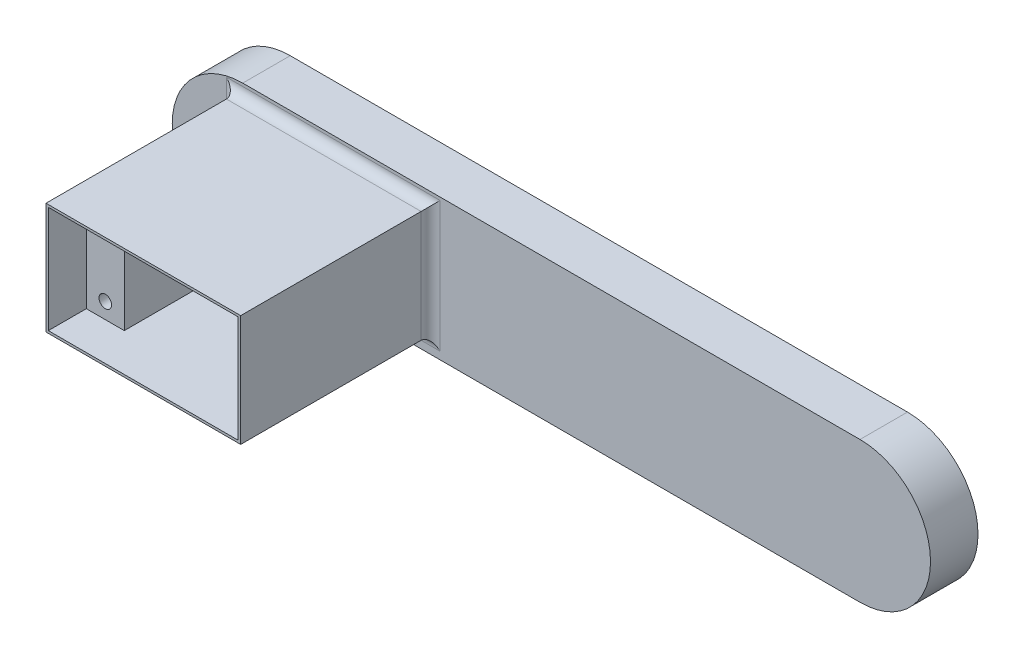
ISO-10303-21;
HEADER;
FILE_DESCRIPTION(('STEP AP214'),'2;1');
FILE_NAME('part.step','',(''),(''),'','','');
FILE_SCHEMA(('AUTOMOTIVE_DESIGN { 1 0 10303 214 1 1 1 1 }'));
ENDSEC;
DATA;
#1=APPLICATION_CONTEXT('core data for automotive mechanical design processes');
#2=APPLICATION_PROTOCOL_DEFINITION('international standard','automotive_design',2000,#1);
#3=PRODUCT_CONTEXT('',#1,'mechanical');
#4=PRODUCT('Part','Part','',(#3));
#5=PRODUCT_RELATED_PRODUCT_CATEGORY('part','',(#4));
#6=PRODUCT_DEFINITION_FORMATION('','',#4);
#7=PRODUCT_DEFINITION_CONTEXT('part definition',#1,'design');
#8=PRODUCT_DEFINITION('design','',#6,#7);
#9=PRODUCT_DEFINITION_SHAPE('','',#8);
#10=(LENGTH_UNIT() NAMED_UNIT(*) SI_UNIT(.MILLI.,.METRE.));
#11=(NAMED_UNIT(*) PLANE_ANGLE_UNIT() SI_UNIT($,.RADIAN.));
#12=(NAMED_UNIT(*) SI_UNIT($,.STERADIAN.) SOLID_ANGLE_UNIT());
#13=UNCERTAINTY_MEASURE_WITH_UNIT(LENGTH_MEASURE(1.E-05),#10,'distance_accuracy_value','');
#14=(GEOMETRIC_REPRESENTATION_CONTEXT(3) GLOBAL_UNCERTAINTY_ASSIGNED_CONTEXT((#13)) GLOBAL_UNIT_ASSIGNED_CONTEXT((#10,
#11,#12)) REPRESENTATION_CONTEXT('',''));
#15=CARTESIAN_POINT('',(0.,0.,0.));
#16=DIRECTION('',(0.,0.,1.));
#17=DIRECTION('',(1.,0.,0.));
#18=AXIS2_PLACEMENT_3D('',#15,#16,#17);
#19=CARTESIAN_POINT('',(-64.6030102473178,-14.8002727924215,50.));
#20=DIRECTION('',(0.,1.,0.));
#21=DIRECTION('',(0.,0.,1.));
#22=AXIS2_PLACEMENT_3D('',#19,#20,#21);
#23=PLANE('',#22);
#24=DIRECTION('',(1.,0.,0.));
#25=VECTOR('',#24,1.);
#26=CARTESIAN_POINT('',(-64.6030102473178,-14.8002727924215,10.));
#27=LINE('',#26,#25);
#28=CARTESIAN_POINT('',(-56.6058718477687,-14.8002727924215,10.));
#29=VERTEX_POINT('',#28);
#30=CARTESIAN_POINT('',(-32.6041144329269,-14.8002727924215,10.));
#31=VERTEX_POINT('',#30);
#32=EDGE_CURVE('E330',#29,#31,#27,.T.);
#33=ORIENTED_EDGE('',*,*,#32,.F.);
#34=DIRECTION('',(0.,0.,-1.));
#35=VECTOR('',#34,1.);
#36=CARTESIAN_POINT('',(-56.6058718477687,-14.8002727924215,42.));
#37=LINE('',#36,#35);
#38=CARTESIAN_POINT('',(-56.6058718477687,-14.8002727924215,42.));
#39=VERTEX_POINT('',#38);
#40=EDGE_CURVE('E190',#39,#29,#37,.T.);
#41=ORIENTED_EDGE('',*,*,#40,.F.);
#42=DIRECTION('',(1.,0.,0.));
#43=VECTOR('',#42,1.);
#44=CARTESIAN_POINT('',(-64.6030102473178,-14.8002727924215,42.));
#45=LINE('',#44,#43);
#46=CARTESIAN_POINT('',(-64.6030102473178,-14.8002727924215,42.));
#47=VERTEX_POINT('',#46);
#48=EDGE_CURVE('E174',#47,#39,#45,.T.);
#49=ORIENTED_EDGE('',*,*,#48,.F.);
#50=DIRECTION('',(0.,0.,-1.));
#51=VECTOR('',#50,1.);
#52=CARTESIAN_POINT('',(-64.6030102473178,-14.8002727924215,50.));
#53=LINE('',#52,#51);
#54=CARTESIAN_POINT('',(-64.6030102473178,-14.8002727924215,50.));
#55=VERTEX_POINT('',#54);
#56=EDGE_CURVE('E188',#55,#47,#53,.T.);
#57=ORIENTED_EDGE('',*,*,#56,.F.);
#58=DIRECTION('',(1.,0.,0.));
#59=VECTOR('',#58,1.);
#60=CARTESIAN_POINT('',(-64.6030102473178,-14.8002727924215,50.));
#61=LINE('',#60,#59);
#62=CARTESIAN_POINT('',(-24.6030102473178,-14.8002727924215,50.));
#63=VERTEX_POINT('',#62);
#64=EDGE_CURVE('E346',#55,#63,#61,.T.);
#65=ORIENTED_EDGE('',*,*,#64,.T.);
#66=DIRECTION('',(0.,0.,-1.));
#67=VECTOR('',#66,1.);
#68=CARTESIAN_POINT('',(-24.6030102473178,-14.8002727924215,50.));
#69=LINE('',#68,#67);
#70=CARTESIAN_POINT('',(-24.6030102473178,-14.8002727924215,42.));
#71=VERTEX_POINT('',#70);
#72=EDGE_CURVE('E197',#63,#71,#69,.T.);
#73=ORIENTED_EDGE('',*,*,#72,.T.);
#74=DIRECTION('',(1.,0.,0.));
#75=VECTOR('',#74,1.);
#76=CARTESIAN_POINT('',(-24.6030102473178,-14.8002727924215,42.));
#77=LINE('',#76,#75);
#78=CARTESIAN_POINT('',(-32.6041144329269,-14.8002727924215,42.));
#79=VERTEX_POINT('',#78);
#80=EDGE_CURVE('E336',#79,#71,#77,.T.);
#81=ORIENTED_EDGE('',*,*,#80,.F.);
#82=DIRECTION('',(0.,0.,-1.));
#83=VECTOR('',#82,1.);
#84=CARTESIAN_POINT('',(-32.6041144329269,-14.8002727924215,42.));
#85=LINE('',#84,#83);
#86=EDGE_CURVE('E333',#79,#31,#85,.T.);
#87=ORIENTED_EDGE('',*,*,#86,.T.);
#88=EDGE_LOOP('',(#33,#41,#49,#57,#65,#73,#81,#87));
#89=FACE_BOUND('',#88,.T.);
#90=ADVANCED_FACE('F38',(#89),#23,.T.);
#91=CARTESIAN_POINT('',(-24.6030102473178,7.69972720757855,50.));
#92=DIRECTION('',(-1.,0.,0.));
#93=DIRECTION('',(0.,0.,1.));
#94=AXIS2_PLACEMENT_3D('',#91,#92,#93);
#95=PLANE('',#94);
#96=DIRECTION('',(0.,0.,-1.));
#97=VECTOR('',#96,1.);
#98=CARTESIAN_POINT('',(-24.6030102473178,7.69972720757855,50.));
#99=LINE('',#98,#97);
#100=CARTESIAN_POINT('',(-24.6030102473178,7.69972720757855,50.));
#101=VERTEX_POINT('',#100);
#102=CARTESIAN_POINT('',(-24.6030102473178,7.69972720757855,42.));
#103=VERTEX_POINT('',#102);
#104=EDGE_CURVE('E203',#101,#103,#99,.T.);
#105=ORIENTED_EDGE('',*,*,#104,.T.);
#106=DIRECTION('',(0.,1.,0.));
#107=VECTOR('',#106,1.);
#108=CARTESIAN_POINT('',(-24.6030102473178,7.69972720757855,42.));
#109=LINE('',#108,#107);
#110=EDGE_CURVE('E338',#71,#103,#109,.T.);
#111=ORIENTED_EDGE('',*,*,#110,.F.);
#112=ORIENTED_EDGE('',*,*,#72,.F.);
#113=DIRECTION('',(0.,1.,0.));
#114=VECTOR('',#113,1.);
#115=CARTESIAN_POINT('',(-24.6030102473178,7.69972720757855,50.));
#116=LINE('',#115,#114);
#117=EDGE_CURVE('E348',#63,#101,#116,.T.);
#118=ORIENTED_EDGE('',*,*,#117,.T.);
#119=EDGE_LOOP('',(#105,#111,#112,#118));
#120=FACE_BOUND('',#119,.T.);
#121=ADVANCED_FACE('F359',(#120),#95,.T.);
#122=CARTESIAN_POINT('',(-64.6030102473178,7.69972720757855,50.));
#123=DIRECTION('',(0.,-1.,0.));
#124=DIRECTION('',(0.,0.,-1.));
#125=AXIS2_PLACEMENT_3D('',#122,#123,#124);
#126=PLANE('',#125);
#127=DIRECTION('',(0.,0.,-1.));
#128=VECTOR('',#127,1.);
#129=CARTESIAN_POINT('',(-56.6058718477687,7.69972720757855,42.));
#130=LINE('',#129,#128);
#131=CARTESIAN_POINT('',(-56.6058718477687,7.69972720757855,42.));
#132=VERTEX_POINT('',#131);
#133=CARTESIAN_POINT('',(-56.6058718477687,7.69972720757855,12.));
#134=VERTEX_POINT('',#133);
#135=EDGE_CURVE('E323',#132,#134,#130,.T.);
#136=ORIENTED_EDGE('',*,*,#135,.T.);
#137=DIRECTION('',(-1.,0.,0.));
#138=VECTOR('',#137,1.);
#139=CARTESIAN_POINT('',(-32.6041144329269,7.69972720757855,12.));
#140=LINE('',#139,#138);
#141=CARTESIAN_POINT('',(-32.6041144329269,7.69972720757855,12.));
#142=VERTEX_POINT('',#141);
#143=EDGE_CURVE('E262',#134,#142,#140,.F.);
#144=ORIENTED_EDGE('',*,*,#143,.T.);
#145=DIRECTION('',(0.,0.,-1.));
#146=VECTOR('',#145,1.);
#147=CARTESIAN_POINT('',(-32.6041144329269,7.69972720757855,42.));
#148=LINE('',#147,#146);
#149=CARTESIAN_POINT('',(-32.6041144329269,7.69972720757855,42.));
#150=VERTEX_POINT('',#149);
#151=EDGE_CURVE('E318',#150,#142,#148,.T.);
#152=ORIENTED_EDGE('',*,*,#151,.F.);
#153=DIRECTION('',(-1.,0.,0.));
#154=VECTOR('',#153,1.);
#155=CARTESIAN_POINT('',(-24.6030102473178,7.69972720757855,42.));
#156=LINE('',#155,#154);
#157=EDGE_CURVE('E342',#103,#150,#156,.T.);
#158=ORIENTED_EDGE('',*,*,#157,.F.);
#159=ORIENTED_EDGE('',*,*,#104,.F.);
#160=DIRECTION('',(-1.,0.,0.));
#161=VECTOR('',#160,1.);
#162=CARTESIAN_POINT('',(-64.6030102473178,7.69972720757855,50.));
#163=LINE('',#162,#161);
#164=CARTESIAN_POINT('',(-64.6030102473178,7.69972720757855,50.));
#165=VERTEX_POINT('',#164);
#166=EDGE_CURVE('E351',#101,#165,#163,.T.);
#167=ORIENTED_EDGE('',*,*,#166,.T.);
#168=DIRECTION('',(0.,0.,-1.));
#169=VECTOR('',#168,1.);
#170=CARTESIAN_POINT('',(-64.6030102473178,7.69972720757855,50.));
#171=LINE('',#170,#169);
#172=CARTESIAN_POINT('',(-64.6030102473178,7.69972720757855,42.));
#173=VERTEX_POINT('',#172);
#174=EDGE_CURVE('E353',#165,#173,#171,.T.);
#175=ORIENTED_EDGE('',*,*,#174,.T.);
#176=DIRECTION('',(-1.,0.,0.));
#177=VECTOR('',#176,1.);
#178=CARTESIAN_POINT('',(-64.6030102473178,7.69972720757855,42.));
#179=LINE('',#178,#177);
#180=EDGE_CURVE('E177',#132,#173,#179,.T.);
#181=ORIENTED_EDGE('',*,*,#180,.F.);
#182=EDGE_LOOP('',(#136,#144,#152,#158,#159,#167,#175,#181));
#183=FACE_BOUND('',#182,.T.);
#184=ADVANCED_FACE('F365',(#183),#126,.T.);
#185=CARTESIAN_POINT('',(-63.6567164179104,-4.02985074626865,10.));
#186=DIRECTION('',(0.,0.,1.));
#187=DIRECTION('',(1.,0.,0.));
#188=AXIS2_PLACEMENT_3D('',#185,#186,#187);
#189=PLANE('',#188);
#190=DIRECTION('',(0.,-1.,0.));
#191=VECTOR('',#190,1.);
#192=CARTESIAN_POINT('',(-32.6041144329269,7.69972720757855,10.));
#193=LINE('',#192,#191);
#194=CARTESIAN_POINT('',(-32.6041144329269,5.69972720757855,10.));
#195=VERTEX_POINT('',#194);
#196=EDGE_CURVE('E326',#195,#31,#193,.T.);
#197=ORIENTED_EDGE('',*,*,#196,.F.);
#198=DIRECTION('',(-1.,0.,0.));
#199=VECTOR('',#198,1.);
#200=CARTESIAN_POINT('',(-56.6058718477687,5.69972720757855,10.));
#201=LINE('',#200,#199);
#202=CARTESIAN_POINT('',(-56.6058718477687,5.69972720757855,10.));
#203=VERTEX_POINT('',#202);
#204=EDGE_CURVE('E257',#195,#203,#201,.T.);
#205=ORIENTED_EDGE('',*,*,#204,.T.);
#206=DIRECTION('',(0.,1.,0.));
#207=VECTOR('',#206,1.);
#208=CARTESIAN_POINT('',(-56.6058718477687,7.69972720757855,10.));
#209=LINE('',#208,#207);
#210=EDGE_CURVE('E182',#29,#203,#209,.T.);
#211=ORIENTED_EDGE('',*,*,#210,.F.);
#212=ORIENTED_EDGE('',*,*,#32,.T.);
#213=EDGE_LOOP('',(#197,#205,#211,#212));
#214=FACE_BOUND('',#213,.T.);
#215=ADVANCED_FACE('F423',(#214),#189,.T.);
#216=DIRECTION('',(0.,-1.,0.));
#217=VECTOR('',#216,1.);
#218=CARTESIAN_POINT('',(-67.0923044639696,-4.02985074626865,10.));
#219=LINE('',#218,#217);
#220=CARTESIAN_POINT('',(-67.0923044639696,-17.3044800682263,10.));
#221=VERTEX_POINT('',#220);
#222=CARTESIAN_POINT('',(-67.0923044639696,10.1955199317737,10.));
#223=VERTEX_POINT('',#222);
#224=EDGE_CURVE('E273',#221,#223,#219,.F.);
#225=ORIENTED_EDGE('',*,*,#224,.T.);
#226=DIRECTION('',(-1.,0.,0.));
#227=VECTOR('',#226,1.);
#228=CARTESIAN_POINT('',(-63.6567164179104,10.1955199317737,10.));
#229=LINE('',#228,#227);
#230=CARTESIAN_POINT('',(-22.0923044639696,10.1955199317737,10.));
#231=VERTEX_POINT('',#230);
#232=EDGE_CURVE('E275',#223,#231,#229,.F.);
#233=ORIENTED_EDGE('',*,*,#232,.T.);
#234=DIRECTION('',(0.,1.,0.));
#235=VECTOR('',#234,1.);
#236=CARTESIAN_POINT('',(-22.0923044639696,-4.02985074626865,10.));
#237=LINE('',#236,#235);
#238=CARTESIAN_POINT('',(-22.0923044639696,-17.3044800682263,10.));
#239=VERTEX_POINT('',#238);
#240=EDGE_CURVE('E269',#231,#239,#237,.F.);
#241=ORIENTED_EDGE('',*,*,#240,.T.);
#242=DIRECTION('',(1.,0.,0.));
#243=VECTOR('',#242,1.);
#244=CARTESIAN_POINT('',(-63.6567164179104,-17.3044800682263,10.));
#245=LINE('',#244,#243);
#246=EDGE_CURVE('E271',#239,#221,#245,.F.);
#247=ORIENTED_EDGE('',*,*,#246,.T.);
#248=EDGE_LOOP('',(#225,#233,#241,#247));
#249=FACE_BOUND('',#248,.T.);
#250=CARTESIAN_POINT('',(-63.6567164179104,-4.02985074626865,10.));
#251=DIRECTION('',(0.,0.,1.));
#252=DIRECTION('',(1.,0.,0.));
#253=AXIS2_PLACEMENT_3D('',#250,#251,#252);
#254=CIRCLE('',#253,14.8507462686567);
#255=CARTESIAN_POINT('',(-63.6567164179104,10.8208955223881,10.));
#256=VERTEX_POINT('',#255);
#257=CARTESIAN_POINT('',(-63.6567164179104,-18.8805970149254,10.));
#258=VERTEX_POINT('',#257);
#259=EDGE_CURVE('E228',#256,#258,#254,.T.);
#260=ORIENTED_EDGE('',*,*,#259,.T.);
#261=DIRECTION('',(1.,0.,0.));
#262=VECTOR('',#261,1.);
#263=CARTESIAN_POINT('',(-63.6567164179104,-18.8805970149254,10.));
#264=LINE('',#263,#262);
#265=CARTESIAN_POINT('',(66.3432835820896,-18.8805970149254,10.));
#266=VERTEX_POINT('',#265);
#267=EDGE_CURVE('E231',#258,#266,#264,.T.);
#268=ORIENTED_EDGE('',*,*,#267,.T.);
#269=CARTESIAN_POINT('',(66.3432835820896,-4.02985074626865,10.));
#270=DIRECTION('',(0.,0.,1.));
#271=DIRECTION('',(1.,0.,0.));
#272=AXIS2_PLACEMENT_3D('',#269,#270,#271);
#273=CIRCLE('',#272,14.8507462686567);
#274=CARTESIAN_POINT('',(66.3432835820896,10.8208955223881,10.));
#275=VERTEX_POINT('',#274);
#276=EDGE_CURVE('E234',#266,#275,#273,.T.);
#277=ORIENTED_EDGE('',*,*,#276,.T.);
#278=DIRECTION('',(-1.,0.,0.));
#279=VECTOR('',#278,1.);
#280=CARTESIAN_POINT('',(-63.6567164179104,10.8208955223881,10.));
#281=LINE('',#280,#279);
#282=EDGE_CURVE('E236',#275,#256,#281,.T.);
#283=ORIENTED_EDGE('',*,*,#282,.T.);
#284=EDGE_LOOP('',(#260,#268,#277,#283));
#285=FACE_BOUND('',#284,.T.);
#286=ADVANCED_FACE('F426',(#249,#285),#189,.T.);
#287=CARTESIAN_POINT('',(-63.6567164179104,-4.02985074626865,10.));
#288=DIRECTION('',(0.,0.,-1.));
#289=DIRECTION('',(-1.,0.,0.));
#290=AXIS2_PLACEMENT_3D('',#287,#288,#289);
#291=CYLINDRICAL_SURFACE('',#290,14.8507462686567);
#292=CARTESIAN_POINT('',(-63.6567164179104,-4.02985074626865,0.));
#293=DIRECTION('',(0.,0.,1.));
#294=DIRECTION('',(1.,0.,0.));
#295=AXIS2_PLACEMENT_3D('',#292,#293,#294);
#296=CIRCLE('',#295,14.8507462686567);
#297=CARTESIAN_POINT('',(-63.6567164179104,10.8208955223881,0.));
#298=VERTEX_POINT('',#297);
#299=CARTESIAN_POINT('',(-63.6567164179104,-18.8805970149254,0.));
#300=VERTEX_POINT('',#299);
#301=EDGE_CURVE('E225',#298,#300,#296,.T.);
#302=ORIENTED_EDGE('',*,*,#301,.T.);
#303=DIRECTION('',(0.,0.,-1.));
#304=VECTOR('',#303,1.);
#305=CARTESIAN_POINT('',(-63.6567164179104,-18.8805970149254,10.));
#306=LINE('',#305,#304);
#307=EDGE_CURVE('E254',#258,#300,#306,.T.);
#308=ORIENTED_EDGE('',*,*,#307,.F.);
#309=ORIENTED_EDGE('',*,*,#259,.F.);
#310=DIRECTION('',(0.,0.,-1.));
#311=VECTOR('',#310,1.);
#312=CARTESIAN_POINT('',(-63.6567164179104,10.8208955223881,10.));
#313=LINE('',#312,#311);
#314=EDGE_CURVE('E238',#256,#298,#313,.T.);
#315=ORIENTED_EDGE('',*,*,#314,.T.);
#316=EDGE_LOOP('',(#302,#308,#309,#315));
#317=FACE_BOUND('',#316,.T.);
#318=ADVANCED_FACE('F442',(#317),#291,.T.);
#319=CARTESIAN_POINT('',(-63.6567164179104,-18.8805970149254,10.));
#320=DIRECTION('',(0.,1.,0.));
#321=DIRECTION('',(0.,0.,1.));
#322=AXIS2_PLACEMENT_3D('',#319,#320,#321);
#323=PLANE('',#322);
#324=DIRECTION('',(1.,0.,0.));
#325=VECTOR('',#324,1.);
#326=CARTESIAN_POINT('',(-63.6567164179104,-18.8805970149254,0.));
#327=LINE('',#326,#325);
#328=CARTESIAN_POINT('',(66.3432835820896,-18.8805970149254,0.));
#329=VERTEX_POINT('',#328);
#330=EDGE_CURVE('E241',#300,#329,#327,.T.);
#331=ORIENTED_EDGE('',*,*,#330,.T.);
#332=DIRECTION('',(0.,0.,-1.));
#333=VECTOR('',#332,1.);
#334=CARTESIAN_POINT('',(66.3432835820896,-18.8805970149254,10.));
#335=LINE('',#334,#333);
#336=EDGE_CURVE('E251',#266,#329,#335,.T.);
#337=ORIENTED_EDGE('',*,*,#336,.F.);
#338=ORIENTED_EDGE('',*,*,#267,.F.);
#339=ORIENTED_EDGE('',*,*,#307,.T.);
#340=EDGE_LOOP('',(#331,#337,#338,#339));
#341=FACE_BOUND('',#340,.T.);
#342=ADVANCED_FACE('F438',(#341),#323,.F.);
#343=CARTESIAN_POINT('',(66.3432835820896,-4.02985074626865,10.));
#344=DIRECTION('',(0.,0.,-1.));
#345=DIRECTION('',(-1.,0.,0.));
#346=AXIS2_PLACEMENT_3D('',#343,#344,#345);
#347=CYLINDRICAL_SURFACE('',#346,14.8507462686567);
#348=CARTESIAN_POINT('',(66.3432835820896,-4.02985074626865,0.));
#349=DIRECTION('',(0.,0.,1.));
#350=DIRECTION('',(1.,0.,0.));
#351=AXIS2_PLACEMENT_3D('',#348,#349,#350);
#352=CIRCLE('',#351,14.8507462686567);
#353=CARTESIAN_POINT('',(66.3432835820896,10.8208955223881,0.));
#354=VERTEX_POINT('',#353);
#355=EDGE_CURVE('E243',#329,#354,#352,.T.);
#356=ORIENTED_EDGE('',*,*,#355,.T.);
#357=DIRECTION('',(0.,0.,-1.));
#358=VECTOR('',#357,1.);
#359=CARTESIAN_POINT('',(66.3432835820896,10.8208955223881,10.));
#360=LINE('',#359,#358);
#361=EDGE_CURVE('E248',#275,#354,#360,.T.);
#362=ORIENTED_EDGE('',*,*,#361,.F.);
#363=ORIENTED_EDGE('',*,*,#276,.F.);
#364=ORIENTED_EDGE('',*,*,#336,.T.);
#365=EDGE_LOOP('',(#356,#362,#363,#364));
#366=FACE_BOUND('',#365,.T.);
#367=ADVANCED_FACE('F434',(#366),#347,.T.);
#368=CARTESIAN_POINT('',(-63.6567164179104,10.8208955223881,10.));
#369=DIRECTION('',(0.,-1.,0.));
#370=DIRECTION('',(0.,0.,-1.));
#371=AXIS2_PLACEMENT_3D('',#368,#369,#370);
#372=PLANE('',#371);
#373=DIRECTION('',(-1.,0.,0.));
#374=VECTOR('',#373,1.);
#375=CARTESIAN_POINT('',(-63.6567164179104,10.8208955223881,0.));
#376=LINE('',#375,#374);
#377=EDGE_CURVE('E232',#354,#298,#376,.T.);
#378=ORIENTED_EDGE('',*,*,#377,.T.);
#379=ORIENTED_EDGE('',*,*,#314,.F.);
#380=ORIENTED_EDGE('',*,*,#282,.F.);
#381=ORIENTED_EDGE('',*,*,#361,.T.);
#382=EDGE_LOOP('',(#378,#379,#380,#381));
#383=FACE_BOUND('',#382,.T.);
#384=ADVANCED_FACE('F430',(#383),#372,.F.);
#385=CARTESIAN_POINT('',(-63.6567164179104,-4.02985074626865,0.));
#386=DIRECTION('',(0.,0.,1.));
#387=DIRECTION('',(1.,0.,0.));
#388=AXIS2_PLACEMENT_3D('',#385,#386,#387);
#389=PLANE('',#388);
#390=CARTESIAN_POINT('',(66.3432835820896,-4.02985074626865,0.));
#391=DIRECTION('',(0.,0.,-1.));
#392=DIRECTION('',(-1.,0.,0.));
#393=AXIS2_PLACEMENT_3D('',#390,#391,#392);
#394=CIRCLE('',#393,3.25000000000001);
#395=CARTESIAN_POINT('',(63.0932835820896,-4.02985074626865,0.));
#396=VERTEX_POINT('',#395);
#397=EDGE_CURVE('E221',#396,#396,#394,.T.);
#398=ORIENTED_EDGE('',*,*,#397,.F.);
#399=EDGE_LOOP('',(#398));
#400=FACE_BOUND('',#399,.T.);
#401=ORIENTED_EDGE('',*,*,#301,.F.);
#402=ORIENTED_EDGE('',*,*,#377,.F.);
#403=ORIENTED_EDGE('',*,*,#355,.F.);
#404=ORIENTED_EDGE('',*,*,#330,.F.);
#405=EDGE_LOOP('',(#401,#402,#403,#404));
#406=FACE_BOUND('',#405,.T.);
#407=ADVANCED_FACE('F421',(#400,#406),#389,.F.);
#408=CARTESIAN_POINT('',(66.3432835820896,-4.02985074626865,5.99999999999999));
#409=DIRECTION('',(0.,0.,-1.));
#410=DIRECTION('',(-1.,0.,0.));
#411=AXIS2_PLACEMENT_3D('',#408,#409,#410);
#412=CYLINDRICAL_SURFACE('',#411,3.25000000000001);
#413=CARTESIAN_POINT('',(66.3432835820896,-4.02985074626865,5.99999999999999));
#414=DIRECTION('',(0.,0.,-1.));
#415=DIRECTION('',(-1.,0.,0.));
#416=AXIS2_PLACEMENT_3D('',#413,#414,#415);
#417=CIRCLE('',#416,3.25000000000001);
#418=CARTESIAN_POINT('',(63.0932835820896,-4.02985074626865,5.99999999999999));
#419=VERTEX_POINT('',#418);
#420=EDGE_CURVE('E222',#419,#419,#417,.T.);
#421=ORIENTED_EDGE('',*,*,#420,.F.);
#422=EDGE_LOOP('',(#421));
#423=FACE_BOUND('',#422,.T.);
#424=ORIENTED_EDGE('',*,*,#397,.T.);
#425=EDGE_LOOP('',(#424));
#426=FACE_BOUND('',#425,.T.);
#427=ADVANCED_FACE('F390',(#423,#426),#412,.F.);
#428=CARTESIAN_POINT('',(66.3432835820896,-4.02985074626865,5.99999999999999));
#429=DIRECTION('',(0.,0.,-1.));
#430=DIRECTION('',(-1.,0.,0.));
#431=AXIS2_PLACEMENT_3D('',#428,#429,#430);
#432=PLANE('',#431);
#433=ORIENTED_EDGE('',*,*,#420,.T.);
#434=EDGE_LOOP('',(#433));
#435=FACE_BOUND('',#434,.T.);
#436=ADVANCED_FACE('F380',(#435),#432,.T.);
#437=CARTESIAN_POINT('',(0.,0.,50.));
#438=DIRECTION('',(0.,0.,1.));
#439=DIRECTION('',(1.,0.,0.));
#440=AXIS2_PLACEMENT_3D('',#437,#438,#439);
#441=PLANE('',#440);
#442=DIRECTION('',(0.,-1.,0.));
#443=VECTOR('',#442,1.);
#444=CARTESIAN_POINT('',(-65.0923044639696,8.19551993177372,50.));
#445=LINE('',#444,#443);
#446=CARTESIAN_POINT('',(-65.0923044639696,8.19551993177372,50.));
#447=VERTEX_POINT('',#446);
#448=CARTESIAN_POINT('',(-65.0923044639696,-15.3044800682263,50.));
#449=VERTEX_POINT('',#448);
#450=EDGE_CURVE('E196',#447,#449,#445,.T.);
#451=ORIENTED_EDGE('',*,*,#450,.T.);
#452=DIRECTION('',(1.,0.,0.));
#453=VECTOR('',#452,1.);
#454=CARTESIAN_POINT('',(-65.0923044639696,-15.3044800682263,50.));
#455=LINE('',#454,#453);
#456=CARTESIAN_POINT('',(-24.0923044639696,-15.3044800682263,50.));
#457=VERTEX_POINT('',#456);
#458=EDGE_CURVE('E200',#449,#457,#455,.T.);
#459=ORIENTED_EDGE('',*,*,#458,.T.);
#460=DIRECTION('',(0.,1.,0.));
#461=VECTOR('',#460,1.);
#462=CARTESIAN_POINT('',(-24.0923044639696,8.19551993177372,50.));
#463=LINE('',#462,#461);
#464=CARTESIAN_POINT('',(-24.0923044639696,8.19551993177372,50.));
#465=VERTEX_POINT('',#464);
#466=EDGE_CURVE('E208',#457,#465,#463,.T.);
#467=ORIENTED_EDGE('',*,*,#466,.T.);
#468=DIRECTION('',(-1.,0.,0.));
#469=VECTOR('',#468,1.);
#470=CARTESIAN_POINT('',(-65.0923044639696,8.19551993177372,50.));
#471=LINE('',#470,#469);
#472=EDGE_CURVE('E210',#465,#447,#471,.T.);
#473=ORIENTED_EDGE('',*,*,#472,.T.);
#474=EDGE_LOOP('',(#451,#459,#467,#473));
#475=FACE_BOUND('',#474,.T.);
#476=ORIENTED_EDGE('',*,*,#64,.F.);
#477=DIRECTION('',(0.,-1.,0.));
#478=VECTOR('',#477,1.);
#479=CARTESIAN_POINT('',(-64.6030102473178,7.69972720757855,50.));
#480=LINE('',#479,#478);
#481=EDGE_CURVE('E195',#165,#55,#480,.T.);
#482=ORIENTED_EDGE('',*,*,#481,.F.);
#483=ORIENTED_EDGE('',*,*,#166,.F.);
#484=ORIENTED_EDGE('',*,*,#117,.F.);
#485=EDGE_LOOP('',(#476,#482,#483,#484));
#486=FACE_BOUND('',#485,.T.);
#487=ADVANCED_FACE('F377',(#475,#486),#441,.T.);
#488=CARTESIAN_POINT('',(-65.0923044639696,8.19551993177372,50.));
#489=DIRECTION('',(1.,0.,0.));
#490=DIRECTION('',(0.,0.,-1.));
#491=AXIS2_PLACEMENT_3D('',#488,#489,#490);
#492=PLANE('',#491);
#493=DIRECTION('',(0.,0.,-1.));
#494=VECTOR('',#493,1.);
#495=CARTESIAN_POINT('',(-65.0923044639696,8.19551993177372,50.));
#496=LINE('',#495,#494);
#497=CARTESIAN_POINT('',(-65.0923044639696,8.19551993177372,12.));
#498=VERTEX_POINT('',#497);
#499=EDGE_CURVE('E212',#447,#498,#496,.T.);
#500=ORIENTED_EDGE('',*,*,#499,.T.);
#501=DIRECTION('',(0.,-1.,0.));
#502=VECTOR('',#501,1.);
#503=CARTESIAN_POINT('',(-65.0923044639696,8.19551993177372,12.));
#504=LINE('',#503,#502);
#505=CARTESIAN_POINT('',(-65.0923044639696,-15.3044800682263,12.));
#506=VERTEX_POINT('',#505);
#507=EDGE_CURVE('E62',#498,#506,#504,.T.);
#508=ORIENTED_EDGE('',*,*,#507,.T.);
#509=DIRECTION('',(0.,0.,-1.));
#510=VECTOR('',#509,1.);
#511=CARTESIAN_POINT('',(-65.0923044639696,-15.3044800682263,50.));
#512=LINE('',#511,#510);
#513=EDGE_CURVE('E219',#449,#506,#512,.T.);
#514=ORIENTED_EDGE('',*,*,#513,.F.);
#515=ORIENTED_EDGE('',*,*,#450,.F.);
#516=EDGE_LOOP('',(#500,#508,#514,#515));
#517=FACE_BOUND('',#516,.T.);
#518=ADVANCED_FACE('F379',(#517),#492,.F.);
#519=CARTESIAN_POINT('',(-65.0923044639696,-15.3044800682263,50.));
#520=DIRECTION('',(0.,1.,0.));
#521=DIRECTION('',(0.,0.,1.));
#522=AXIS2_PLACEMENT_3D('',#519,#520,#521);
#523=PLANE('',#522);
#524=ORIENTED_EDGE('',*,*,#513,.T.);
#525=DIRECTION('',(1.,0.,0.));
#526=VECTOR('',#525,1.);
#527=CARTESIAN_POINT('',(-65.0923044639696,-15.3044800682263,12.));
#528=LINE('',#527,#526);
#529=CARTESIAN_POINT('',(-24.0923044639696,-15.3044800682263,12.));
#530=VERTEX_POINT('',#529);
#531=EDGE_CURVE('E47',#506,#530,#528,.T.);
#532=ORIENTED_EDGE('',*,*,#531,.T.);
#533=DIRECTION('',(0.,0.,-1.));
#534=VECTOR('',#533,1.);
#535=CARTESIAN_POINT('',(-24.0923044639696,-15.3044800682263,50.));
#536=LINE('',#535,#534);
#537=EDGE_CURVE('E217',#457,#530,#536,.T.);
#538=ORIENTED_EDGE('',*,*,#537,.F.);
#539=ORIENTED_EDGE('',*,*,#458,.F.);
#540=EDGE_LOOP('',(#524,#532,#538,#539));
#541=FACE_BOUND('',#540,.T.);
#542=ADVANCED_FACE('F388',(#541),#523,.F.);
#543=CARTESIAN_POINT('',(-24.0923044639696,8.19551993177372,50.));
#544=DIRECTION('',(-1.,0.,0.));
#545=DIRECTION('',(0.,0.,1.));
#546=AXIS2_PLACEMENT_3D('',#543,#544,#545);
#547=PLANE('',#546);
#548=ORIENTED_EDGE('',*,*,#537,.T.);
#549=DIRECTION('',(0.,1.,0.));
#550=VECTOR('',#549,1.);
#551=CARTESIAN_POINT('',(-24.0923044639696,8.19551993177372,12.));
#552=LINE('',#551,#550);
#553=CARTESIAN_POINT('',(-24.0923044639696,8.19551993177372,12.));
#554=VERTEX_POINT('',#553);
#555=EDGE_CURVE('E11',#530,#554,#552,.T.);
#556=ORIENTED_EDGE('',*,*,#555,.T.);
#557=DIRECTION('',(0.,0.,-1.));
#558=VECTOR('',#557,1.);
#559=CARTESIAN_POINT('',(-24.0923044639696,8.19551993177372,50.));
#560=LINE('',#559,#558);
#561=EDGE_CURVE('E214',#465,#554,#560,.T.);
#562=ORIENTED_EDGE('',*,*,#561,.F.);
#563=ORIENTED_EDGE('',*,*,#466,.F.);
#564=EDGE_LOOP('',(#548,#556,#562,#563));
#565=FACE_BOUND('',#564,.T.);
#566=ADVANCED_FACE('F409',(#565),#547,.F.);
#567=CARTESIAN_POINT('',(-65.0923044639696,8.19551993177372,50.));
#568=DIRECTION('',(0.,-1.,0.));
#569=DIRECTION('',(0.,0.,-1.));
#570=AXIS2_PLACEMENT_3D('',#567,#568,#569);
#571=PLANE('',#570);
#572=ORIENTED_EDGE('',*,*,#561,.T.);
#573=DIRECTION('',(-1.,0.,0.));
#574=VECTOR('',#573,1.);
#575=CARTESIAN_POINT('',(-65.0923044639696,8.19551993177372,12.));
#576=LINE('',#575,#574);
#577=EDGE_CURVE('E266',#554,#498,#576,.T.);
#578=ORIENTED_EDGE('',*,*,#577,.T.);
#579=ORIENTED_EDGE('',*,*,#499,.F.);
#580=ORIENTED_EDGE('',*,*,#472,.F.);
#581=EDGE_LOOP('',(#572,#578,#579,#580));
#582=FACE_BOUND('',#581,.T.);
#583=ADVANCED_FACE('F402',(#582),#571,.F.);
#584=CARTESIAN_POINT('',(-64.6030102473178,7.69972720757855,50.));
#585=DIRECTION('',(1.,0.,0.));
#586=DIRECTION('',(0.,0.,-1.));
#587=AXIS2_PLACEMENT_3D('',#584,#585,#586);
#588=PLANE('',#587);
#589=DIRECTION('',(0.,-1.,0.));
#590=VECTOR('',#589,1.);
#591=CARTESIAN_POINT('',(-64.6030102473178,7.69972720757855,42.));
#592=LINE('',#591,#590);
#593=EDGE_CURVE('E171',#173,#47,#592,.T.);
#594=ORIENTED_EDGE('',*,*,#593,.F.);
#595=ORIENTED_EDGE('',*,*,#174,.F.);
#596=ORIENTED_EDGE('',*,*,#481,.T.);
#597=ORIENTED_EDGE('',*,*,#56,.T.);
#598=EDGE_LOOP('',(#594,#595,#596,#597));
#599=FACE_BOUND('',#598,.T.);
#600=ADVANCED_FACE('F193',(#599),#588,.T.);
#601=CARTESIAN_POINT('',(-32.6041144329269,7.69972720757855,42.));
#602=DIRECTION('',(1.,0.,0.));
#603=DIRECTION('',(0.,0.,-1.));
#604=AXIS2_PLACEMENT_3D('',#601,#602,#603);
#605=PLANE('',#604);
#606=ORIENTED_EDGE('',*,*,#151,.T.);
#607=CARTESIAN_POINT('',(-32.6041144329269,5.69972720757855,12.));
#608=DIRECTION('',(1.,0.,0.));
#609=DIRECTION('',(0.,0.,-1.));
#610=AXIS2_PLACEMENT_3D('',#607,#608,#609);
#611=CIRCLE('',#610,2.);
#612=EDGE_CURVE('E264',#142,#195,#611,.F.);
#613=ORIENTED_EDGE('',*,*,#612,.T.);
#614=ORIENTED_EDGE('',*,*,#196,.T.);
#615=ORIENTED_EDGE('',*,*,#86,.F.);
#616=DIRECTION('',(0.,-1.,0.));
#617=VECTOR('',#616,1.);
#618=CARTESIAN_POINT('',(-32.6041144329269,7.69972720757855,42.));
#619=LINE('',#618,#617);
#620=EDGE_CURVE('E340',#150,#79,#619,.T.);
#621=ORIENTED_EDGE('',*,*,#620,.F.);
#622=EDGE_LOOP('',(#606,#613,#614,#615,#621));
#623=FACE_BOUND('',#622,.T.);
#624=ADVANCED_FACE('F372',(#623),#605,.F.);
#625=CARTESIAN_POINT('',(0.,0.,42.));
#626=DIRECTION('',(0.,0.,-1.));
#627=DIRECTION('',(-1.,0.,0.));
#628=AXIS2_PLACEMENT_3D('',#625,#626,#627);
#629=PLANE('',#628);
#630=CARTESIAN_POINT('',(-28.6035623401224,3.80691036740336,42.));
#631=DIRECTION('',(0.,0.,1.));
#632=DIRECTION('',(1.,0.,0.));
#633=AXIS2_PLACEMENT_3D('',#630,#631,#632);
#634=CIRCLE('',#633,1.30198676527159);
#635=CARTESIAN_POINT('',(-27.3015755748508,3.80691036740336,42.));
#636=VERTEX_POINT('',#635);
#637=EDGE_CURVE('E303',#636,#636,#634,.T.);
#638=ORIENTED_EDGE('',*,*,#637,.F.);
#639=EDGE_LOOP('',(#638));
#640=FACE_BOUND('',#639,.T.);
#641=CARTESIAN_POINT('',(-28.6035623401224,-11.4712220538319,42.));
#642=DIRECTION('',(0.,0.,1.));
#643=DIRECTION('',(1.,0.,0.));
#644=AXIS2_PLACEMENT_3D('',#641,#642,#643);
#645=CIRCLE('',#644,1.31004098123467);
#646=CARTESIAN_POINT('',(-27.2935213588877,-11.4712220538319,42.));
#647=VERTEX_POINT('',#646);
#648=EDGE_CURVE('E295',#647,#647,#645,.T.);
#649=ORIENTED_EDGE('',*,*,#648,.F.);
#650=EDGE_LOOP('',(#649));
#651=FACE_BOUND('',#650,.T.);
#652=ORIENTED_EDGE('',*,*,#110,.T.);
#653=ORIENTED_EDGE('',*,*,#157,.T.);
#654=ORIENTED_EDGE('',*,*,#620,.T.);
#655=ORIENTED_EDGE('',*,*,#80,.T.);
#656=EDGE_LOOP('',(#652,#653,#654,#655));
#657=FACE_BOUND('',#656,.T.);
#658=ADVANCED_FACE('F369',(#640,#651,#657),#629,.F.);
#659=CARTESIAN_POINT('',(-56.6058718477687,7.69972720757855,42.));
#660=DIRECTION('',(-1.,0.,0.));
#661=DIRECTION('',(0.,0.,1.));
#662=AXIS2_PLACEMENT_3D('',#659,#660,#661);
#663=PLANE('',#662);
#664=ORIENTED_EDGE('',*,*,#210,.T.);
#665=CARTESIAN_POINT('',(-56.6058718477687,5.69972720757855,12.));
#666=DIRECTION('',(-1.,0.,0.));
#667=DIRECTION('',(0.,0.,1.));
#668=AXIS2_PLACEMENT_3D('',#665,#666,#667);
#669=CIRCLE('',#668,2.);
#670=EDGE_CURVE('E260',#203,#134,#669,.F.);
#671=ORIENTED_EDGE('',*,*,#670,.T.);
#672=ORIENTED_EDGE('',*,*,#135,.F.);
#673=DIRECTION('',(0.,1.,0.));
#674=VECTOR('',#673,1.);
#675=CARTESIAN_POINT('',(-56.6058718477687,7.69972720757855,42.));
#676=LINE('',#675,#674);
#677=EDGE_CURVE('E191',#39,#132,#676,.T.);
#678=ORIENTED_EDGE('',*,*,#677,.F.);
#679=ORIENTED_EDGE('',*,*,#40,.T.);
#680=EDGE_LOOP('',(#664,#671,#672,#678,#679));
#681=FACE_BOUND('',#680,.T.);
#682=ADVANCED_FACE('F555',(#681),#663,.F.);
#683=CARTESIAN_POINT('',(0.,0.,42.));
#684=DIRECTION('',(0.,0.,1.));
#685=DIRECTION('',(1.,0.,0.));
#686=AXIS2_PLACEMENT_3D('',#683,#684,#685);
#687=PLANE('',#686);
#688=CARTESIAN_POINT('',(-60.6044410475433,-11.4712220538319,42.));
#689=DIRECTION('',(0.,0.,1.));
#690=DIRECTION('',(1.,0.,0.));
#691=AXIS2_PLACEMENT_3D('',#688,#689,#690);
#692=CIRCLE('',#691,1.3192647350096);
#693=CARTESIAN_POINT('',(-59.2851763125337,-11.4712220538319,42.));
#694=VERTEX_POINT('',#693);
#695=EDGE_CURVE('E310',#694,#694,#692,.T.);
#696=ORIENTED_EDGE('',*,*,#695,.F.);
#697=EDGE_LOOP('',(#696));
#698=FACE_BOUND('',#697,.T.);
#699=CARTESIAN_POINT('',(-60.6044410475433,3.80691036740336,42.));
#700=DIRECTION('',(0.,0.,1.));
#701=DIRECTION('',(1.,0.,0.));
#702=AXIS2_PLACEMENT_3D('',#699,#700,#701);
#703=CIRCLE('',#702,1.26176986748567);
#704=CARTESIAN_POINT('',(-59.3426711800576,3.80691036740336,42.));
#705=VERTEX_POINT('',#704);
#706=EDGE_CURVE('E306',#705,#705,#703,.T.);
#707=ORIENTED_EDGE('',*,*,#706,.F.);
#708=EDGE_LOOP('',(#707));
#709=FACE_BOUND('',#708,.T.);
#710=ORIENTED_EDGE('',*,*,#593,.T.);
#711=ORIENTED_EDGE('',*,*,#48,.T.);
#712=ORIENTED_EDGE('',*,*,#677,.T.);
#713=ORIENTED_EDGE('',*,*,#180,.T.);
#714=EDGE_LOOP('',(#710,#711,#712,#713));
#715=FACE_BOUND('',#714,.T.);
#716=ADVANCED_FACE('F173',(#698,#709,#715),#687,.T.);
#717=CARTESIAN_POINT('',(-60.6044410475433,3.80691036740336,36.));
#718=DIRECTION('',(0.,0.,1.));
#719=DIRECTION('',(1.,0.,0.));
#720=AXIS2_PLACEMENT_3D('',#717,#718,#719);
#721=CYLINDRICAL_SURFACE('',#720,1.26176986748567);
#722=CARTESIAN_POINT('',(-60.6044410475433,3.80691036740336,36.));
#723=DIRECTION('',(0.,0.,1.));
#724=DIRECTION('',(1.,0.,0.));
#725=AXIS2_PLACEMENT_3D('',#722,#723,#724);
#726=CIRCLE('',#725,1.26176986748567);
#727=CARTESIAN_POINT('',(-59.3426711800576,3.80691036740336,36.));
#728=VERTEX_POINT('',#727);
#729=EDGE_CURVE('E315',#728,#728,#726,.T.);
#730=ORIENTED_EDGE('',*,*,#729,.F.);
#731=EDGE_LOOP('',(#730));
#732=FACE_BOUND('',#731,.T.);
#733=ORIENTED_EDGE('',*,*,#706,.T.);
#734=EDGE_LOOP('',(#733));
#735=FACE_BOUND('',#734,.T.);
#736=ADVANCED_FACE('F573',(#732,#735),#721,.F.);
#737=CARTESIAN_POINT('',(-60.6044410475433,3.80691036740336,36.));
#738=DIRECTION('',(0.,0.,1.));
#739=DIRECTION('',(1.,0.,0.));
#740=AXIS2_PLACEMENT_3D('',#737,#738,#739);
#741=PLANE('',#740);
#742=ORIENTED_EDGE('',*,*,#729,.T.);
#743=EDGE_LOOP('',(#742));
#744=FACE_BOUND('',#743,.T.);
#745=ADVANCED_FACE('F583',(#744),#741,.T.);
#746=CARTESIAN_POINT('',(-60.6044410475433,-11.4712220538319,36.));
#747=DIRECTION('',(0.,0.,1.));
#748=DIRECTION('',(1.,0.,0.));
#749=AXIS2_PLACEMENT_3D('',#746,#747,#748);
#750=CYLINDRICAL_SURFACE('',#749,1.3192647350096);
#751=CARTESIAN_POINT('',(-60.6044410475433,-11.4712220538319,36.));
#752=DIRECTION('',(0.,0.,1.));
#753=DIRECTION('',(1.,0.,0.));
#754=AXIS2_PLACEMENT_3D('',#751,#752,#753);
#755=CIRCLE('',#754,1.3192647350096);
#756=CARTESIAN_POINT('',(-59.2851763125337,-11.4712220538319,36.));
#757=VERTEX_POINT('',#756);
#758=EDGE_CURVE('E300',#757,#757,#755,.T.);
#759=ORIENTED_EDGE('',*,*,#758,.F.);
#760=EDGE_LOOP('',(#759));
#761=FACE_BOUND('',#760,.T.);
#762=ORIENTED_EDGE('',*,*,#695,.T.);
#763=EDGE_LOOP('',(#762));
#764=FACE_BOUND('',#763,.T.);
#765=ADVANCED_FACE('F593',(#761,#764),#750,.F.);
#766=CARTESIAN_POINT('',(-60.6044410475433,-11.4712220538319,36.));
#767=DIRECTION('',(0.,0.,1.));
#768=DIRECTION('',(1.,0.,0.));
#769=AXIS2_PLACEMENT_3D('',#766,#767,#768);
#770=PLANE('',#769);
#771=ORIENTED_EDGE('',*,*,#758,.T.);
#772=EDGE_LOOP('',(#771));
#773=FACE_BOUND('',#772,.T.);
#774=ADVANCED_FACE('F603',(#773),#770,.T.);
#775=CARTESIAN_POINT('',(-28.6035623401224,-11.4712220538319,36.));
#776=DIRECTION('',(0.,0.,1.));
#777=DIRECTION('',(1.,0.,0.));
#778=AXIS2_PLACEMENT_3D('',#775,#776,#777);
#779=CYLINDRICAL_SURFACE('',#778,1.31004098123467);
#780=CARTESIAN_POINT('',(-28.6035623401224,-11.4712220538319,36.));
#781=DIRECTION('',(0.,0.,1.));
#782=DIRECTION('',(1.,0.,0.));
#783=AXIS2_PLACEMENT_3D('',#780,#781,#782);
#784=CIRCLE('',#783,1.31004098123467);
#785=CARTESIAN_POINT('',(-27.2935213588877,-11.4712220538319,36.));
#786=VERTEX_POINT('',#785);
#787=EDGE_CURVE('E289',#786,#786,#784,.T.);
#788=ORIENTED_EDGE('',*,*,#787,.F.);
#789=EDGE_LOOP('',(#788));
#790=FACE_BOUND('',#789,.T.);
#791=ORIENTED_EDGE('',*,*,#648,.T.);
#792=EDGE_LOOP('',(#791));
#793=FACE_BOUND('',#792,.T.);
#794=ADVANCED_FACE('F613',(#790,#793),#779,.F.);
#795=CARTESIAN_POINT('',(-28.6035623401224,-11.4712220538319,36.));
#796=DIRECTION('',(0.,0.,1.));
#797=DIRECTION('',(1.,0.,0.));
#798=AXIS2_PLACEMENT_3D('',#795,#796,#797);
#799=PLANE('',#798);
#800=ORIENTED_EDGE('',*,*,#787,.T.);
#801=EDGE_LOOP('',(#800));
#802=FACE_BOUND('',#801,.T.);
#803=ADVANCED_FACE('F623',(#802),#799,.T.);
#804=CARTESIAN_POINT('',(-28.6035623401224,3.80691036740336,36.));
#805=DIRECTION('',(0.,0.,1.));
#806=DIRECTION('',(1.,0.,0.));
#807=AXIS2_PLACEMENT_3D('',#804,#805,#806);
#808=CYLINDRICAL_SURFACE('',#807,1.30198676527159);
#809=CARTESIAN_POINT('',(-28.6035623401224,3.80691036740336,36.));
#810=DIRECTION('',(0.,0.,1.));
#811=DIRECTION('',(1.,0.,0.));
#812=AXIS2_PLACEMENT_3D('',#809,#810,#811);
#813=CIRCLE('',#812,1.30198676527159);
#814=CARTESIAN_POINT('',(-27.3015755748508,3.80691036740336,36.));
#815=VERTEX_POINT('',#814);
#816=EDGE_CURVE('E307',#815,#815,#813,.T.);
#817=ORIENTED_EDGE('',*,*,#816,.F.);
#818=EDGE_LOOP('',(#817));
#819=FACE_BOUND('',#818,.T.);
#820=ORIENTED_EDGE('',*,*,#637,.T.);
#821=EDGE_LOOP('',(#820));
#822=FACE_BOUND('',#821,.T.);
#823=ADVANCED_FACE('F633',(#819,#822),#808,.F.);
#824=CARTESIAN_POINT('',(-28.6035623401224,3.80691036740336,36.));
#825=DIRECTION('',(0.,0.,1.));
#826=DIRECTION('',(1.,0.,0.));
#827=AXIS2_PLACEMENT_3D('',#824,#825,#826);
#828=PLANE('',#827);
#829=ORIENTED_EDGE('',*,*,#816,.T.);
#830=EDGE_LOOP('',(#829));
#831=FACE_BOUND('',#830,.T.);
#832=ADVANCED_FACE('F450',(#831),#828,.T.);
#833=CARTESIAN_POINT('',(-63.6567164179104,5.69972720757855,12.));
#834=DIRECTION('',(1.,0.,0.));
#835=DIRECTION('',(0.,0.,-1.));
#836=AXIS2_PLACEMENT_3D('',#833,#834,#835);
#837=CYLINDRICAL_SURFACE('',#836,2.);
#838=ORIENTED_EDGE('',*,*,#612,.F.);
#839=ORIENTED_EDGE('',*,*,#143,.F.);
#840=ORIENTED_EDGE('',*,*,#670,.F.);
#841=ORIENTED_EDGE('',*,*,#204,.F.);
#842=EDGE_LOOP('',(#838,#839,#840,#841));
#843=FACE_BOUND('',#842,.T.);
#844=ADVANCED_FACE('F447',(#843),#837,.F.);
#845=CARTESIAN_POINT('',(-65.0923044639696,-17.3044800682263,12.));
#846=DIRECTION('',(1.,0.,0.));
#847=DIRECTION('',(0.,0.,-1.));
#848=AXIS2_PLACEMENT_3D('',#845,#846,#847);
#849=CYLINDRICAL_SURFACE('',#848,2.);
#850=CARTESIAN_POINT('',(-67.0923044639696,-17.3044800682263,12.));
#851=DIRECTION('',(0.707106781186547,-0.707106781186547,0.));
#852=DIRECTION('',(0.707106781186547,0.707106781186547,0.));
#853=AXIS2_PLACEMENT_3D('',#850,#851,#852);
#854=ELLIPSE('',#853,2.82842712474619,2.);
#855=EDGE_CURVE('E283',#221,#506,#854,.T.);
#856=ORIENTED_EDGE('',*,*,#855,.F.);
#857=ORIENTED_EDGE('',*,*,#246,.F.);
#858=CARTESIAN_POINT('',(-22.0923044639696,-17.3044800682263,12.));
#859=DIRECTION('',(0.707106781186547,0.707106781186547,0.));
#860=DIRECTION('',(-0.707106781186547,0.707106781186547,0.));
#861=AXIS2_PLACEMENT_3D('',#858,#859,#860);
#862=ELLIPSE('',#861,2.82842712474619,2.);
#863=EDGE_CURVE('E42',#530,#239,#862,.F.);
#864=ORIENTED_EDGE('',*,*,#863,.F.);
#865=ORIENTED_EDGE('',*,*,#531,.F.);
#866=EDGE_LOOP('',(#856,#857,#864,#865));
#867=FACE_BOUND('',#866,.T.);
#868=ADVANCED_FACE('F40',(#867),#849,.F.);
#869=CARTESIAN_POINT('',(-22.0923044639696,8.19551993177372,12.));
#870=DIRECTION('',(0.,1.,0.));
#871=DIRECTION('',(0.,0.,1.));
#872=AXIS2_PLACEMENT_3D('',#869,#870,#871);
#873=CYLINDRICAL_SURFACE('',#872,2.);
#874=ORIENTED_EDGE('',*,*,#863,.T.);
#875=ORIENTED_EDGE('',*,*,#240,.F.);
#876=CARTESIAN_POINT('',(-22.0923044639696,10.1955199317737,12.));
#877=DIRECTION('',(-0.707106781186547,0.707106781186547,0.));
#878=DIRECTION('',(0.707106781186547,0.707106781186547,0.));
#879=AXIS2_PLACEMENT_3D('',#876,#877,#878);
#880=ELLIPSE('',#879,2.82842712474619,2.);
#881=EDGE_CURVE('E282',#554,#231,#880,.F.);
#882=ORIENTED_EDGE('',*,*,#881,.F.);
#883=ORIENTED_EDGE('',*,*,#555,.F.);
#884=EDGE_LOOP('',(#874,#875,#882,#883));
#885=FACE_BOUND('',#884,.T.);
#886=ADVANCED_FACE('F458',(#885),#873,.F.);
#887=CARTESIAN_POINT('',(-67.0923044639696,8.19551993177372,12.));
#888=DIRECTION('',(0.,-1.,0.));
#889=DIRECTION('',(0.,0.,-1.));
#890=AXIS2_PLACEMENT_3D('',#887,#888,#889);
#891=CYLINDRICAL_SURFACE('',#890,2.);
#892=ORIENTED_EDGE('',*,*,#855,.T.);
#893=ORIENTED_EDGE('',*,*,#507,.F.);
#894=CARTESIAN_POINT('',(-67.0923044639696,10.1955199317737,12.));
#895=DIRECTION('',(-0.707106781186547,-0.707106781186547,0.));
#896=DIRECTION('',(0.707106781186547,-0.707106781186547,0.));
#897=AXIS2_PLACEMENT_3D('',#894,#895,#896);
#898=ELLIPSE('',#897,2.82842712474619,2.);
#899=EDGE_CURVE('E280',#223,#498,#898,.T.);
#900=ORIENTED_EDGE('',*,*,#899,.F.);
#901=ORIENTED_EDGE('',*,*,#224,.F.);
#902=EDGE_LOOP('',(#892,#893,#900,#901));
#903=FACE_BOUND('',#902,.T.);
#904=ADVANCED_FACE('F455',(#903),#891,.F.);
#905=CARTESIAN_POINT('',(-65.0923044639696,10.1955199317737,12.));
#906=DIRECTION('',(-1.,0.,0.));
#907=DIRECTION('',(0.,0.,1.));
#908=AXIS2_PLACEMENT_3D('',#905,#906,#907);
#909=CYLINDRICAL_SURFACE('',#908,2.);
#910=ORIENTED_EDGE('',*,*,#881,.T.);
#911=ORIENTED_EDGE('',*,*,#232,.F.);
#912=ORIENTED_EDGE('',*,*,#899,.T.);
#913=ORIENTED_EDGE('',*,*,#577,.F.);
#914=EDGE_LOOP('',(#910,#911,#912,#913));
#915=FACE_BOUND('',#914,.T.);
#916=ADVANCED_FACE('F452',(#915),#909,.F.);
#917=CLOSED_SHELL('',(#90,#121,#184,#215,#286,#318,#342,#367,#384,#407,#427,#436,#487,#518,#542,
#566,#583,#600,#624,#658,#682,#716,#736,#745,#765,#774,#794,#803,#823,#832,#844,#868,#886,#904,#916));
#918=MANIFOLD_SOLID_BREP('B2',#917);
#919=ADVANCED_BREP_SHAPE_REPRESENTATION('',(#18,#918),#14);
#920=SHAPE_DEFINITION_REPRESENTATION(#9,#919);
ENDSEC;
END-ISO-10303-21;
